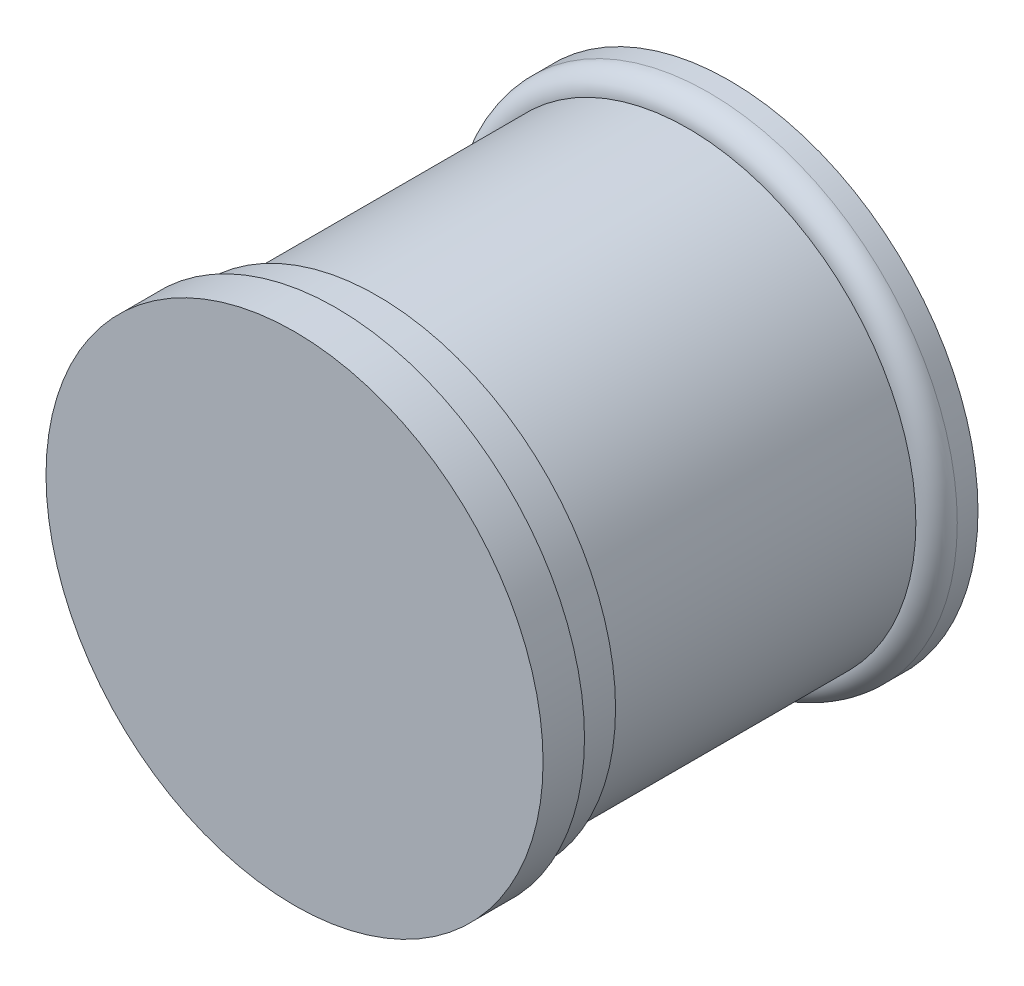
ISO-10303-21;
HEADER;
FILE_DESCRIPTION(('STEP AP214'),'2;1');
FILE_NAME('part.step','',(''),(''),'','','');
FILE_SCHEMA(('AUTOMOTIVE_DESIGN { 1 0 10303 214 1 1 1 1 }'));
ENDSEC;
DATA;
#1=APPLICATION_CONTEXT('core data for automotive mechanical design processes');
#2=APPLICATION_PROTOCOL_DEFINITION('international standard','automotive_design',2000,#1);
#3=PRODUCT_CONTEXT('',#1,'mechanical');
#4=PRODUCT('Part','Part','',(#3));
#5=PRODUCT_RELATED_PRODUCT_CATEGORY('part','',(#4));
#6=PRODUCT_DEFINITION_FORMATION('','',#4);
#7=PRODUCT_DEFINITION_CONTEXT('part definition',#1,'design');
#8=PRODUCT_DEFINITION('design','',#6,#7);
#9=PRODUCT_DEFINITION_SHAPE('','',#8);
#10=(LENGTH_UNIT() NAMED_UNIT(*) SI_UNIT(.MILLI.,.METRE.));
#11=(NAMED_UNIT(*) PLANE_ANGLE_UNIT() SI_UNIT($,.RADIAN.));
#12=(NAMED_UNIT(*) SI_UNIT($,.STERADIAN.) SOLID_ANGLE_UNIT());
#13=UNCERTAINTY_MEASURE_WITH_UNIT(LENGTH_MEASURE(1.E-05),#10,'distance_accuracy_value','');
#14=(GEOMETRIC_REPRESENTATION_CONTEXT(3) GLOBAL_UNCERTAINTY_ASSIGNED_CONTEXT((#13)) GLOBAL_UNIT_ASSIGNED_CONTEXT((#10,
#11,#12)) REPRESENTATION_CONTEXT('',''));
#15=CARTESIAN_POINT('',(0.,0.,0.));
#16=DIRECTION('',(0.,0.,1.));
#17=DIRECTION('',(1.,0.,0.));
#18=AXIS2_PLACEMENT_3D('',#15,#16,#17);
#19=CARTESIAN_POINT('',(0.,0.,100.));
#20=DIRECTION('',(0.,0.,-1.));
#21=DIRECTION('',(-1.,0.,0.));
#22=AXIS2_PLACEMENT_3D('',#19,#20,#21);
#23=CYLINDRICAL_SURFACE('',#22,600.);
#24=CARTESIAN_POINT('',(0.,0.,50.));
#25=DIRECTION('',(0.,0.,1.));
#26=DIRECTION('',(1.,0.,0.));
#27=AXIS2_PLACEMENT_3D('',#24,#25,#26);
#28=CIRCLE('',#27,600.);
#29=CARTESIAN_POINT('',(600.,0.,50.));
#30=VERTEX_POINT('',#29);
#31=EDGE_CURVE('E10',#30,#30,#28,.F.);
#32=ORIENTED_EDGE('',*,*,#31,.T.);
#33=EDGE_LOOP('',(#32));
#34=FACE_BOUND('',#33,.T.);
#35=CARTESIAN_POINT('',(0.,0.,0.));
#36=DIRECTION('',(0.,0.,1.));
#37=DIRECTION('',(1.,0.,0.));
#38=AXIS2_PLACEMENT_3D('',#35,#36,#37);
#39=CIRCLE('',#38,600.);
#40=CARTESIAN_POINT('',(600.,0.,0.));
#41=VERTEX_POINT('',#40);
#42=EDGE_CURVE('E54',#41,#41,#39,.T.);
#43=ORIENTED_EDGE('',*,*,#42,.T.);
#44=EDGE_LOOP('',(#43));
#45=FACE_BOUND('',#44,.T.);
#46=ADVANCED_FACE('F43',(#34,#45),#23,.T.);
#47=CARTESIAN_POINT('',(0.,0.,0.));
#48=DIRECTION('',(0.,0.,1.));
#49=DIRECTION('',(1.,0.,0.));
#50=AXIS2_PLACEMENT_3D('',#47,#48,#49);
#51=PLANE('',#50);
#52=ORIENTED_EDGE('',*,*,#42,.F.);
#53=EDGE_LOOP('',(#52));
#54=FACE_BOUND('',#53,.T.);
#55=ADVANCED_FACE('F94',(#54),#51,.F.);
#56=CARTESIAN_POINT('',(0.,0.,850.));
#57=DIRECTION('',(0.,0.,-1.));
#58=DIRECTION('',(-1.,0.,0.));
#59=AXIS2_PLACEMENT_3D('',#56,#57,#58);
#60=CYLINDRICAL_SURFACE('',#59,550.);
#61=CARTESIAN_POINT('',(0.,0.,850.));
#62=DIRECTION('',(0.,0.,1.));
#63=DIRECTION('',(1.,0.,0.));
#64=AXIS2_PLACEMENT_3D('',#61,#62,#63);
#65=CIRCLE('',#64,550.);
#66=CARTESIAN_POINT('',(550.,0.,850.));
#67=VERTEX_POINT('',#66);
#68=EDGE_CURVE('E59',#67,#67,#65,.T.);
#69=ORIENTED_EDGE('',*,*,#68,.F.);
#70=EDGE_LOOP('',(#69));
#71=FACE_BOUND('',#70,.T.);
#72=CARTESIAN_POINT('',(0.,0.,100.));
#73=DIRECTION('',(0.,0.,1.));
#74=DIRECTION('',(1.,0.,0.));
#75=AXIS2_PLACEMENT_3D('',#72,#73,#74);
#76=CIRCLE('',#75,550.);
#77=CARTESIAN_POINT('',(550.,0.,100.));
#78=VERTEX_POINT('',#77);
#79=EDGE_CURVE('E50',#78,#78,#76,.T.);
#80=ORIENTED_EDGE('',*,*,#79,.T.);
#81=EDGE_LOOP('',(#80));
#82=FACE_BOUND('',#81,.T.);
#83=ADVANCED_FACE('F100',(#71,#82),#60,.T.);
#84=CARTESIAN_POINT('',(0.,0.,50.));
#85=DIRECTION('',(0.,0.,1.));
#86=DIRECTION('',(1.,0.,0.));
#87=AXIS2_PLACEMENT_3D('',#84,#85,#86);
#88=TOROIDAL_SURFACE('',#87,550.,50.);
#89=ORIENTED_EDGE('',*,*,#31,.F.);
#90=EDGE_LOOP('',(#89));
#91=FACE_BOUND('',#90,.T.);
#92=ORIENTED_EDGE('',*,*,#79,.F.);
#93=EDGE_LOOP('',(#92));
#94=FACE_BOUND('',#93,.T.);
#95=ADVANCED_FACE('F45',(#91,#94),#88,.T.);
#96=CARTESIAN_POINT('',(0.,0.,950.));
#97=DIRECTION('',(0.,0.,-1.));
#98=DIRECTION('',(-1.,0.,0.));
#99=AXIS2_PLACEMENT_3D('',#96,#97,#98);
#100=CYLINDRICAL_SURFACE('',#99,575.);
#101=CARTESIAN_POINT('',(0.,0.,950.));
#102=DIRECTION('',(0.,0.,1.));
#103=DIRECTION('',(1.,0.,0.));
#104=AXIS2_PLACEMENT_3D('',#101,#102,#103);
#105=CIRCLE('',#104,575.);
#106=CARTESIAN_POINT('',(575.,0.,950.));
#107=VERTEX_POINT('',#106);
#108=EDGE_CURVE('E63',#107,#107,#105,.T.);
#109=ORIENTED_EDGE('',*,*,#108,.F.);
#110=EDGE_LOOP('',(#109));
#111=FACE_BOUND('',#110,.T.);
#112=CARTESIAN_POINT('',(0.,0.,850.));
#113=DIRECTION('',(0.,0.,1.));
#114=DIRECTION('',(1.,0.,0.));
#115=AXIS2_PLACEMENT_3D('',#112,#113,#114);
#116=CIRCLE('',#115,575.);
#117=CARTESIAN_POINT('',(575.,0.,850.));
#118=VERTEX_POINT('',#117);
#119=EDGE_CURVE('E64',#118,#118,#116,.T.);
#120=ORIENTED_EDGE('',*,*,#119,.T.);
#121=EDGE_LOOP('',(#120));
#122=FACE_BOUND('',#121,.T.);
#123=ADVANCED_FACE('F107',(#111,#122),#100,.T.);
#124=CARTESIAN_POINT('',(0.,0.,850.));
#125=DIRECTION('',(0.,0.,1.));
#126=DIRECTION('',(1.,0.,0.));
#127=AXIS2_PLACEMENT_3D('',#124,#125,#126);
#128=PLANE('',#127);
#129=ORIENTED_EDGE('',*,*,#68,.T.);
#130=EDGE_LOOP('',(#129));
#131=FACE_BOUND('',#130,.T.);
#132=ORIENTED_EDGE('',*,*,#119,.F.);
#133=EDGE_LOOP('',(#132));
#134=FACE_BOUND('',#133,.T.);
#135=ADVANCED_FACE('F81',(#131,#134),#128,.F.);
#136=CARTESIAN_POINT('',(0.,0.,1050.));
#137=DIRECTION('',(0.,0.,-1.));
#138=DIRECTION('',(-1.,0.,0.));
#139=AXIS2_PLACEMENT_3D('',#136,#137,#138);
#140=CYLINDRICAL_SURFACE('',#139,600.);
#141=CARTESIAN_POINT('',(0.,0.,1050.));
#142=DIRECTION('',(0.,0.,1.));
#143=DIRECTION('',(1.,0.,0.));
#144=AXIS2_PLACEMENT_3D('',#141,#142,#143);
#145=CIRCLE('',#144,600.);
#146=CARTESIAN_POINT('',(600.,0.,1050.));
#147=VERTEX_POINT('',#146);
#148=EDGE_CURVE('E67',#147,#147,#145,.T.);
#149=ORIENTED_EDGE('',*,*,#148,.F.);
#150=EDGE_LOOP('',(#149));
#151=FACE_BOUND('',#150,.T.);
#152=CARTESIAN_POINT('',(0.,0.,950.));
#153=DIRECTION('',(0.,0.,1.));
#154=DIRECTION('',(1.,0.,0.));
#155=AXIS2_PLACEMENT_3D('',#152,#153,#154);
#156=CIRCLE('',#155,600.);
#157=CARTESIAN_POINT('',(600.,0.,950.));
#158=VERTEX_POINT('',#157);
#159=EDGE_CURVE('E70',#158,#158,#156,.T.);
#160=ORIENTED_EDGE('',*,*,#159,.T.);
#161=EDGE_LOOP('',(#160));
#162=FACE_BOUND('',#161,.T.);
#163=ADVANCED_FACE('F78',(#151,#162),#140,.T.);
#164=CARTESIAN_POINT('',(0.,0.,1050.));
#165=DIRECTION('',(0.,0.,1.));
#166=DIRECTION('',(1.,0.,0.));
#167=AXIS2_PLACEMENT_3D('',#164,#165,#166);
#168=PLANE('',#167);
#169=ORIENTED_EDGE('',*,*,#148,.T.);
#170=EDGE_LOOP('',(#169));
#171=FACE_BOUND('',#170,.T.);
#172=ADVANCED_FACE('F76',(#171),#168,.T.);
#173=CARTESIAN_POINT('',(0.,0.,950.));
#174=DIRECTION('',(0.,0.,1.));
#175=DIRECTION('',(1.,0.,0.));
#176=AXIS2_PLACEMENT_3D('',#173,#174,#175);
#177=PLANE('',#176);
#178=ORIENTED_EDGE('',*,*,#108,.T.);
#179=EDGE_LOOP('',(#178));
#180=FACE_BOUND('',#179,.T.);
#181=ORIENTED_EDGE('',*,*,#159,.F.);
#182=EDGE_LOOP('',(#181));
#183=FACE_BOUND('',#182,.T.);
#184=ADVANCED_FACE('F85',(#180,#183),#177,.F.);
#185=CLOSED_SHELL('',(#46,#55,#83,#95,#123,#135,#163,#172,#184));
#186=MANIFOLD_SOLID_BREP('B2',#185);
#187=ADVANCED_BREP_SHAPE_REPRESENTATION('',(#18,#186),#14);
#188=SHAPE_DEFINITION_REPRESENTATION(#9,#187);
ENDSEC;
END-ISO-10303-21;
